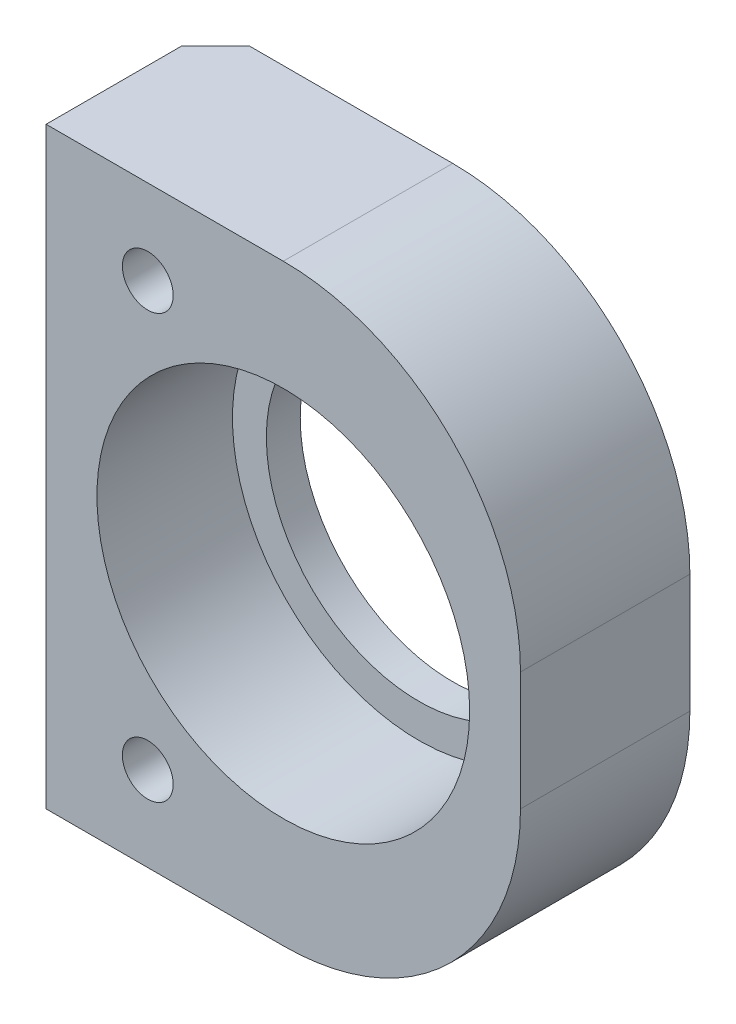
ISO-10303-21;
HEADER;
FILE_DESCRIPTION(('STEP AP214'),'2;1');
FILE_NAME('part.step','',(''),(''),'','','');
FILE_SCHEMA(('AUTOMOTIVE_DESIGN { 1 0 10303 214 1 1 1 1 }'));
ENDSEC;
DATA;
#1=APPLICATION_CONTEXT('core data for automotive mechanical design processes');
#2=APPLICATION_PROTOCOL_DEFINITION('international standard','automotive_design',2000,#1);
#3=PRODUCT_CONTEXT('',#1,'mechanical');
#4=PRODUCT('Part','Part','',(#3));
#5=PRODUCT_RELATED_PRODUCT_CATEGORY('part','',(#4));
#6=PRODUCT_DEFINITION_FORMATION('','',#4);
#7=PRODUCT_DEFINITION_CONTEXT('part definition',#1,'design');
#8=PRODUCT_DEFINITION('design','',#6,#7);
#9=PRODUCT_DEFINITION_SHAPE('','',#8);
#10=(LENGTH_UNIT() NAMED_UNIT(*) SI_UNIT(.MILLI.,.METRE.));
#11=(NAMED_UNIT(*) PLANE_ANGLE_UNIT() SI_UNIT($,.RADIAN.));
#12=(NAMED_UNIT(*) SI_UNIT($,.STERADIAN.) SOLID_ANGLE_UNIT());
#13=UNCERTAINTY_MEASURE_WITH_UNIT(LENGTH_MEASURE(1.E-05),#10,'distance_accuracy_value','');
#14=(GEOMETRIC_REPRESENTATION_CONTEXT(3) GLOBAL_UNCERTAINTY_ASSIGNED_CONTEXT((#13)) GLOBAL_UNIT_ASSIGNED_CONTEXT((#10,
#11,#12)) REPRESENTATION_CONTEXT('',''));
#15=CARTESIAN_POINT('',(0.,0.,0.));
#16=DIRECTION('',(0.,0.,1.));
#17=DIRECTION('',(1.,0.,0.));
#18=AXIS2_PLACEMENT_3D('',#15,#16,#17);
#19=CARTESIAN_POINT('',(0.,0.,10.));
#20=DIRECTION('',(0.,0.,-1.));
#21=DIRECTION('',(-1.,0.,0.));
#22=AXIS2_PLACEMENT_3D('',#19,#20,#21);
#23=PLANE('',#22);
#24=DIRECTION('',(0.,1.,0.));
#25=VECTOR('',#24,1.);
#26=CARTESIAN_POINT('',(14.,17.5,10.));
#27=LINE('',#26,#25);
#28=CARTESIAN_POINT('',(14.,-3.5,10.));
#29=VERTEX_POINT('',#28);
#30=CARTESIAN_POINT('',(14.,3.5,10.));
#31=VERTEX_POINT('',#30);
#32=EDGE_CURVE('E111',#29,#31,#27,.T.);
#33=ORIENTED_EDGE('',*,*,#32,.T.);
#34=CARTESIAN_POINT('',(0.,3.5,10.));
#35=DIRECTION('',(0.,0.,-1.));
#36=DIRECTION('',(-1.,0.,0.));
#37=AXIS2_PLACEMENT_3D('',#34,#35,#36);
#38=CIRCLE('',#37,14.);
#39=CARTESIAN_POINT('',(0.,17.5,10.));
#40=VERTEX_POINT('',#39);
#41=EDGE_CURVE('E109',#31,#40,#38,.F.);
#42=ORIENTED_EDGE('',*,*,#41,.T.);
#43=DIRECTION('',(-1.,0.,0.));
#44=VECTOR('',#43,1.);
#45=CARTESIAN_POINT('',(-14.,17.5,10.));
#46=LINE('',#45,#44);
#47=CARTESIAN_POINT('',(-14.,17.5,10.));
#48=VERTEX_POINT('',#47);
#49=EDGE_CURVE('E101',#40,#48,#46,.T.);
#50=ORIENTED_EDGE('',*,*,#49,.T.);
#51=DIRECTION('',(0.,-1.,0.));
#52=VECTOR('',#51,1.);
#53=CARTESIAN_POINT('',(-14.,17.5,10.));
#54=LINE('',#53,#52);
#55=CARTESIAN_POINT('',(-14.,-17.5,10.));
#56=VERTEX_POINT('',#55);
#57=EDGE_CURVE('E110',#48,#56,#54,.T.);
#58=ORIENTED_EDGE('',*,*,#57,.T.);
#59=DIRECTION('',(1.,0.,0.));
#60=VECTOR('',#59,1.);
#61=CARTESIAN_POINT('',(-14.,-17.5,10.));
#62=LINE('',#61,#60);
#63=CARTESIAN_POINT('',(0.,-17.5,10.));
#64=VERTEX_POINT('',#63);
#65=EDGE_CURVE('E140',#56,#64,#62,.T.);
#66=ORIENTED_EDGE('',*,*,#65,.T.);
#67=CARTESIAN_POINT('',(0.,-3.5,10.));
#68=DIRECTION('',(0.,0.,-1.));
#69=DIRECTION('',(-1.,0.,0.));
#70=AXIS2_PLACEMENT_3D('',#67,#68,#69);
#71=CIRCLE('',#70,14.);
#72=EDGE_CURVE('E154',#64,#29,#71,.F.);
#73=ORIENTED_EDGE('',*,*,#72,.T.);
#74=EDGE_LOOP('',(#33,#42,#50,#58,#66,#73));
#75=FACE_BOUND('',#74,.T.);
#76=CARTESIAN_POINT('',(0.,0.,10.));
#77=DIRECTION('',(0.,0.,1.));
#78=DIRECTION('',(1.,0.,0.));
#79=AXIS2_PLACEMENT_3D('',#76,#77,#78);
#80=CIRCLE('',#79,11.);
#81=CARTESIAN_POINT('',(11.,0.,10.));
#82=VERTEX_POINT('',#81);
#83=EDGE_CURVE('E132',#82,#82,#80,.T.);
#84=ORIENTED_EDGE('',*,*,#83,.F.);
#85=EDGE_LOOP('',(#84));
#86=FACE_BOUND('',#85,.T.);
#87=CARTESIAN_POINT('',(-8.,-12.5,10.));
#88=DIRECTION('',(0.,0.,1.));
#89=DIRECTION('',(1.,0.,0.));
#90=AXIS2_PLACEMENT_3D('',#87,#88,#89);
#91=CIRCLE('',#90,1.5);
#92=CARTESIAN_POINT('',(-6.5,-12.5,10.));
#93=VERTEX_POINT('',#92);
#94=EDGE_CURVE('E168',#93,#93,#91,.T.);
#95=ORIENTED_EDGE('',*,*,#94,.F.);
#96=EDGE_LOOP('',(#95));
#97=FACE_BOUND('',#96,.T.);
#98=CARTESIAN_POINT('',(-8.,12.5,10.));
#99=DIRECTION('',(0.,0.,1.));
#100=DIRECTION('',(-1.,0.,0.));
#101=AXIS2_PLACEMENT_3D('',#98,#99,#100);
#102=CIRCLE('',#101,1.5);
#103=CARTESIAN_POINT('',(-9.5,12.5,10.));
#104=VERTEX_POINT('',#103);
#105=EDGE_CURVE('E173',#104,#104,#102,.T.);
#106=ORIENTED_EDGE('',*,*,#105,.F.);
#107=EDGE_LOOP('',(#106));
#108=FACE_BOUND('',#107,.T.);
#109=ADVANCED_FACE('F43',(#75,#86,#97,#108),#23,.F.);
#110=CARTESIAN_POINT('',(0.,0.,0.));
#111=DIRECTION('',(0.,0.,-1.));
#112=DIRECTION('',(-1.,0.,0.));
#113=AXIS2_PLACEMENT_3D('',#110,#111,#112);
#114=PLANE('',#113);
#115=CARTESIAN_POINT('',(-8.,-12.5,0.));
#116=DIRECTION('',(0.,0.,1.));
#117=DIRECTION('',(1.,0.,0.));
#118=AXIS2_PLACEMENT_3D('',#115,#116,#117);
#119=CIRCLE('',#118,1.5);
#120=CARTESIAN_POINT('',(-6.5,-12.5,0.));
#121=VERTEX_POINT('',#120);
#122=EDGE_CURVE('E174',#121,#121,#119,.T.);
#123=ORIENTED_EDGE('',*,*,#122,.T.);
#124=EDGE_LOOP('',(#123));
#125=FACE_BOUND('',#124,.T.);
#126=DIRECTION('',(1.,0.,0.));
#127=VECTOR('',#126,1.);
#128=CARTESIAN_POINT('',(-14.,-17.5,0.));
#129=LINE('',#128,#127);
#130=CARTESIAN_POINT('',(-12.,-17.5,0.));
#131=VERTEX_POINT('',#130);
#132=CARTESIAN_POINT('',(0.,-17.5,0.));
#133=VERTEX_POINT('',#132);
#134=EDGE_CURVE('E131',#131,#133,#129,.T.);
#135=ORIENTED_EDGE('',*,*,#134,.F.);
#136=DIRECTION('',(0.,1.,0.));
#137=VECTOR('',#136,1.);
#138=CARTESIAN_POINT('',(-12.,17.5,0.));
#139=LINE('',#138,#137);
#140=CARTESIAN_POINT('',(-12.,17.5,0.));
#141=VERTEX_POINT('',#140);
#142=EDGE_CURVE('E55',#131,#141,#139,.T.);
#143=ORIENTED_EDGE('',*,*,#142,.T.);
#144=DIRECTION('',(-1.,0.,0.));
#145=VECTOR('',#144,1.);
#146=CARTESIAN_POINT('',(-14.,17.5,0.));
#147=LINE('',#146,#145);
#148=CARTESIAN_POINT('',(0.,17.5,0.));
#149=VERTEX_POINT('',#148);
#150=EDGE_CURVE('E137',#149,#141,#147,.T.);
#151=ORIENTED_EDGE('',*,*,#150,.F.);
#152=CARTESIAN_POINT('',(0.,3.5,0.));
#153=DIRECTION('',(0.,0.,-1.));
#154=DIRECTION('',(-1.,0.,0.));
#155=AXIS2_PLACEMENT_3D('',#152,#153,#154);
#156=CIRCLE('',#155,14.);
#157=CARTESIAN_POINT('',(14.,3.5,0.));
#158=VERTEX_POINT('',#157);
#159=EDGE_CURVE('E146',#149,#158,#156,.T.);
#160=ORIENTED_EDGE('',*,*,#159,.T.);
#161=DIRECTION('',(0.,1.,0.));
#162=VECTOR('',#161,1.);
#163=CARTESIAN_POINT('',(14.,17.5,0.));
#164=LINE('',#163,#162);
#165=CARTESIAN_POINT('',(14.,-3.5,0.));
#166=VERTEX_POINT('',#165);
#167=EDGE_CURVE('E133',#166,#158,#164,.T.);
#168=ORIENTED_EDGE('',*,*,#167,.F.);
#169=CARTESIAN_POINT('',(0.,-3.5,0.));
#170=DIRECTION('',(0.,0.,-1.));
#171=DIRECTION('',(-1.,0.,0.));
#172=AXIS2_PLACEMENT_3D('',#169,#170,#171);
#173=CIRCLE('',#172,14.);
#174=EDGE_CURVE('E144',#166,#133,#173,.T.);
#175=ORIENTED_EDGE('',*,*,#174,.T.);
#176=EDGE_LOOP('',(#135,#143,#151,#160,#168,#175));
#177=FACE_BOUND('',#176,.T.);
#178=CARTESIAN_POINT('',(-8.,12.5,0.));
#179=DIRECTION('',(0.,0.,1.));
#180=DIRECTION('',(-1.,0.,0.));
#181=AXIS2_PLACEMENT_3D('',#178,#179,#180);
#182=CIRCLE('',#181,1.5);
#183=CARTESIAN_POINT('',(-9.5,12.5,0.));
#184=VERTEX_POINT('',#183);
#185=EDGE_CURVE('E179',#184,#184,#182,.T.);
#186=ORIENTED_EDGE('',*,*,#185,.T.);
#187=EDGE_LOOP('',(#186));
#188=FACE_BOUND('',#187,.T.);
#189=CARTESIAN_POINT('',(0.,0.,0.));
#190=DIRECTION('',(0.,0.,1.));
#191=DIRECTION('',(1.,0.,0.));
#192=AXIS2_PLACEMENT_3D('',#189,#190,#191);
#193=CIRCLE('',#192,9.);
#194=CARTESIAN_POINT('',(9.,0.,0.));
#195=VERTEX_POINT('',#194);
#196=EDGE_CURVE('E181',#195,#195,#193,.T.);
#197=ORIENTED_EDGE('',*,*,#196,.T.);
#198=EDGE_LOOP('',(#197));
#199=FACE_BOUND('',#198,.T.);
#200=ADVANCED_FACE('F208',(#125,#177,#188,#199),#114,.T.);
#201=CARTESIAN_POINT('',(-14.,-17.5,10.));
#202=DIRECTION('',(0.,1.,0.));
#203=DIRECTION('',(0.,0.,1.));
#204=AXIS2_PLACEMENT_3D('',#201,#202,#203);
#205=PLANE('',#204);
#206=DIRECTION('',(0.,0.,-1.));
#207=VECTOR('',#206,1.);
#208=CARTESIAN_POINT('',(-14.,-17.5,10.));
#209=LINE('',#208,#207);
#210=CARTESIAN_POINT('',(-14.,-17.5,2.));
#211=VERTEX_POINT('',#210);
#212=EDGE_CURVE('E125',#56,#211,#209,.T.);
#213=ORIENTED_EDGE('',*,*,#212,.T.);
#214=DIRECTION('',(0.707106781186549,0.,-0.707106781186546));
#215=VECTOR('',#214,1.);
#216=CARTESIAN_POINT('',(-14.,-17.5,2.));
#217=LINE('',#216,#215);
#218=EDGE_CURVE('E68',#211,#131,#217,.T.);
#219=ORIENTED_EDGE('',*,*,#218,.T.);
#220=ORIENTED_EDGE('',*,*,#134,.T.);
#221=DIRECTION('',(0.,0.,-1.));
#222=VECTOR('',#221,1.);
#223=CARTESIAN_POINT('',(0.,-17.5,10.));
#224=LINE('',#223,#222);
#225=EDGE_CURVE('E158',#133,#64,#224,.F.);
#226=ORIENTED_EDGE('',*,*,#225,.T.);
#227=ORIENTED_EDGE('',*,*,#65,.F.);
#228=EDGE_LOOP('',(#213,#219,#220,#226,#227));
#229=FACE_BOUND('',#228,.T.);
#230=ADVANCED_FACE('F162',(#229),#205,.F.);
#231=CARTESIAN_POINT('',(14.,17.5,10.));
#232=DIRECTION('',(-1.,0.,0.));
#233=DIRECTION('',(0.,0.,1.));
#234=AXIS2_PLACEMENT_3D('',#231,#232,#233);
#235=PLANE('',#234);
#236=ORIENTED_EDGE('',*,*,#167,.T.);
#237=DIRECTION('',(0.,0.,-1.));
#238=VECTOR('',#237,1.);
#239=CARTESIAN_POINT('',(14.,3.5,10.));
#240=LINE('',#239,#238);
#241=EDGE_CURVE('E153',#158,#31,#240,.F.);
#242=ORIENTED_EDGE('',*,*,#241,.T.);
#243=ORIENTED_EDGE('',*,*,#32,.F.);
#244=DIRECTION('',(0.,0.,-1.));
#245=VECTOR('',#244,1.);
#246=CARTESIAN_POINT('',(14.,-3.5,10.));
#247=LINE('',#246,#245);
#248=EDGE_CURVE('E147',#29,#166,#247,.T.);
#249=ORIENTED_EDGE('',*,*,#248,.T.);
#250=EDGE_LOOP('',(#236,#242,#243,#249));
#251=FACE_BOUND('',#250,.T.);
#252=ADVANCED_FACE('F221',(#251),#235,.F.);
#253=CARTESIAN_POINT('',(-14.,17.5,10.));
#254=DIRECTION('',(0.,-1.,0.));
#255=DIRECTION('',(0.,0.,-1.));
#256=AXIS2_PLACEMENT_3D('',#253,#254,#255);
#257=PLANE('',#256);
#258=ORIENTED_EDGE('',*,*,#150,.T.);
#259=DIRECTION('',(-0.707106781186549,0.,0.707106781186546));
#260=VECTOR('',#259,1.);
#261=CARTESIAN_POINT('',(-14.,17.5,2.));
#262=LINE('',#261,#260);
#263=CARTESIAN_POINT('',(-14.,17.5,2.));
#264=VERTEX_POINT('',#263);
#265=EDGE_CURVE('E11',#141,#264,#262,.T.);
#266=ORIENTED_EDGE('',*,*,#265,.T.);
#267=DIRECTION('',(0.,0.,-1.));
#268=VECTOR('',#267,1.);
#269=CARTESIAN_POINT('',(-14.,17.5,10.));
#270=LINE('',#269,#268);
#271=EDGE_CURVE('E116',#48,#264,#270,.T.);
#272=ORIENTED_EDGE('',*,*,#271,.F.);
#273=ORIENTED_EDGE('',*,*,#49,.F.);
#274=DIRECTION('',(0.,0.,-1.));
#275=VECTOR('',#274,1.);
#276=CARTESIAN_POINT('',(0.,17.5,10.));
#277=LINE('',#276,#275);
#278=EDGE_CURVE('E141',#40,#149,#277,.T.);
#279=ORIENTED_EDGE('',*,*,#278,.T.);
#280=EDGE_LOOP('',(#258,#266,#272,#273,#279));
#281=FACE_BOUND('',#280,.T.);
#282=ADVANCED_FACE('F120',(#281),#257,.F.);
#283=CARTESIAN_POINT('',(-14.,17.5,10.));
#284=DIRECTION('',(1.,0.,0.));
#285=DIRECTION('',(0.,0.,-1.));
#286=AXIS2_PLACEMENT_3D('',#283,#284,#285);
#287=PLANE('',#286);
#288=ORIENTED_EDGE('',*,*,#271,.T.);
#289=DIRECTION('',(0.,-1.,0.));
#290=VECTOR('',#289,1.);
#291=CARTESIAN_POINT('',(-14.,-17.5,2.));
#292=LINE('',#291,#290);
#293=EDGE_CURVE('E159',#264,#211,#292,.T.);
#294=ORIENTED_EDGE('',*,*,#293,.T.);
#295=ORIENTED_EDGE('',*,*,#212,.F.);
#296=ORIENTED_EDGE('',*,*,#57,.F.);
#297=EDGE_LOOP('',(#288,#294,#295,#296));
#298=FACE_BOUND('',#297,.T.);
#299=ADVANCED_FACE('F127',(#298),#287,.F.);
#300=CARTESIAN_POINT('',(0.,0.,10.));
#301=DIRECTION('',(0.,0.,-1.));
#302=DIRECTION('',(-1.,0.,0.));
#303=AXIS2_PLACEMENT_3D('',#300,#301,#302);
#304=CYLINDRICAL_SURFACE('',#303,11.);
#305=CARTESIAN_POINT('',(0.,0.,2.));
#306=DIRECTION('',(0.,0.,1.));
#307=DIRECTION('',(1.,0.,0.));
#308=AXIS2_PLACEMENT_3D('',#305,#306,#307);
#309=CIRCLE('',#308,11.);
#310=CARTESIAN_POINT('',(11.,0.,2.));
#311=VERTEX_POINT('',#310);
#312=EDGE_CURVE('E122',#311,#311,#309,.T.);
#313=ORIENTED_EDGE('',*,*,#312,.F.);
#314=EDGE_LOOP('',(#313));
#315=FACE_BOUND('',#314,.T.);
#316=ORIENTED_EDGE('',*,*,#83,.T.);
#317=EDGE_LOOP('',(#316));
#318=FACE_BOUND('',#317,.T.);
#319=ADVANCED_FACE('F220',(#315,#318),#304,.F.);
#320=CARTESIAN_POINT('',(-8.,-12.5,10.));
#321=DIRECTION('',(0.,0.,-1.));
#322=DIRECTION('',(-1.,0.,0.));
#323=AXIS2_PLACEMENT_3D('',#320,#321,#322);
#324=CYLINDRICAL_SURFACE('',#323,1.5);
#325=ORIENTED_EDGE('',*,*,#94,.T.);
#326=EDGE_LOOP('',(#325));
#327=FACE_BOUND('',#326,.T.);
#328=ORIENTED_EDGE('',*,*,#122,.F.);
#329=EDGE_LOOP('',(#328));
#330=FACE_BOUND('',#329,.T.);
#331=ADVANCED_FACE('F204',(#327,#330),#324,.F.);
#332=CARTESIAN_POINT('',(-8.,12.5,10.));
#333=DIRECTION('',(0.,0.,-1.));
#334=DIRECTION('',(-1.,0.,0.));
#335=AXIS2_PLACEMENT_3D('',#332,#333,#334);
#336=CYLINDRICAL_SURFACE('',#335,1.5);
#337=ORIENTED_EDGE('',*,*,#105,.T.);
#338=EDGE_LOOP('',(#337));
#339=FACE_BOUND('',#338,.T.);
#340=ORIENTED_EDGE('',*,*,#185,.F.);
#341=EDGE_LOOP('',(#340));
#342=FACE_BOUND('',#341,.T.);
#343=ADVANCED_FACE('F195',(#339,#342),#336,.F.);
#344=CARTESIAN_POINT('',(0.,0.,2.));
#345=DIRECTION('',(0.,0.,1.));
#346=DIRECTION('',(1.,0.,0.));
#347=AXIS2_PLACEMENT_3D('',#344,#345,#346);
#348=PLANE('',#347);
#349=ORIENTED_EDGE('',*,*,#312,.T.);
#350=EDGE_LOOP('',(#349));
#351=FACE_BOUND('',#350,.T.);
#352=CARTESIAN_POINT('',(0.,0.,2.));
#353=DIRECTION('',(0.,0.,1.));
#354=DIRECTION('',(1.,0.,0.));
#355=AXIS2_PLACEMENT_3D('',#352,#353,#354);
#356=CIRCLE('',#355,9.);
#357=CARTESIAN_POINT('',(9.,0.,2.));
#358=VERTEX_POINT('',#357);
#359=EDGE_CURVE('E176',#358,#358,#356,.T.);
#360=ORIENTED_EDGE('',*,*,#359,.F.);
#361=EDGE_LOOP('',(#360));
#362=FACE_BOUND('',#361,.T.);
#363=ADVANCED_FACE('F194',(#351,#362),#348,.T.);
#364=CARTESIAN_POINT('',(0.,0.,2.));
#365=DIRECTION('',(0.,0.,-1.));
#366=DIRECTION('',(-1.,0.,0.));
#367=AXIS2_PLACEMENT_3D('',#364,#365,#366);
#368=CYLINDRICAL_SURFACE('',#367,9.);
#369=ORIENTED_EDGE('',*,*,#359,.T.);
#370=EDGE_LOOP('',(#369));
#371=FACE_BOUND('',#370,.T.);
#372=ORIENTED_EDGE('',*,*,#196,.F.);
#373=EDGE_LOOP('',(#372));
#374=FACE_BOUND('',#373,.T.);
#375=ADVANCED_FACE('F188',(#371,#374),#368,.F.);
#376=CARTESIAN_POINT('',(0.,3.5,10.));
#377=DIRECTION('',(0.,0.,-1.));
#378=DIRECTION('',(-1.,0.,0.));
#379=AXIS2_PLACEMENT_3D('',#376,#377,#378);
#380=CYLINDRICAL_SURFACE('',#379,14.);
#381=ORIENTED_EDGE('',*,*,#41,.F.);
#382=ORIENTED_EDGE('',*,*,#241,.F.);
#383=ORIENTED_EDGE('',*,*,#159,.F.);
#384=ORIENTED_EDGE('',*,*,#278,.F.);
#385=EDGE_LOOP('',(#381,#382,#383,#384));
#386=FACE_BOUND('',#385,.T.);
#387=ADVANCED_FACE('F203',(#386),#380,.T.);
#388=CARTESIAN_POINT('',(0.,-3.5,10.));
#389=DIRECTION('',(0.,0.,-1.));
#390=DIRECTION('',(-1.,0.,0.));
#391=AXIS2_PLACEMENT_3D('',#388,#389,#390);
#392=CYLINDRICAL_SURFACE('',#391,14.);
#393=ORIENTED_EDGE('',*,*,#72,.F.);
#394=ORIENTED_EDGE('',*,*,#225,.F.);
#395=ORIENTED_EDGE('',*,*,#174,.F.);
#396=ORIENTED_EDGE('',*,*,#248,.F.);
#397=EDGE_LOOP('',(#393,#394,#395,#396));
#398=FACE_BOUND('',#397,.T.);
#399=ADVANCED_FACE('F227',(#398),#392,.T.);
#400=CARTESIAN_POINT('',(-14.,17.5,2.));
#401=DIRECTION('',(-0.707106781186546,0.,-0.707106781186549));
#402=DIRECTION('',(0.,1.,0.));
#403=AXIS2_PLACEMENT_3D('',#400,#401,#402);
#404=PLANE('',#403);
#405=ORIENTED_EDGE('',*,*,#265,.F.);
#406=ORIENTED_EDGE('',*,*,#142,.F.);
#407=ORIENTED_EDGE('',*,*,#218,.F.);
#408=ORIENTED_EDGE('',*,*,#293,.F.);
#409=EDGE_LOOP('',(#405,#406,#407,#408));
#410=FACE_BOUND('',#409,.T.);
#411=ADVANCED_FACE('F46',(#410),#404,.T.);
#412=CLOSED_SHELL('',(#109,#200,#230,#252,#282,#299,#319,#331,#343,#363,#375,#387,#399,#411));
#413=MANIFOLD_SOLID_BREP('B2',#412);
#414=ADVANCED_BREP_SHAPE_REPRESENTATION('',(#18,#413),#14);
#415=SHAPE_DEFINITION_REPRESENTATION(#9,#414);
ENDSEC;
END-ISO-10303-21;
